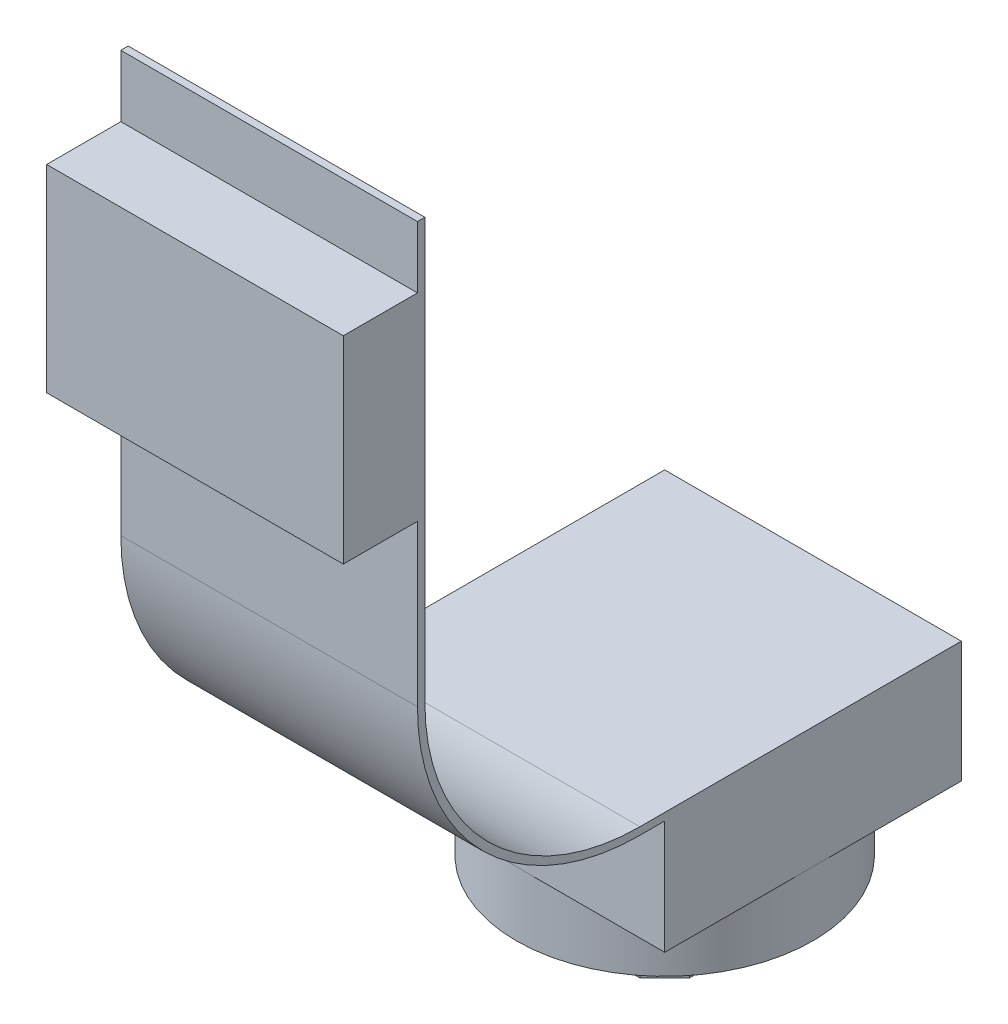
ISO-10303-21;
HEADER;
FILE_DESCRIPTION(('STEP AP214'),'2;1');
FILE_NAME('part.step','',(''),(''),'','','');
FILE_SCHEMA(('AUTOMOTIVE_DESIGN { 1 0 10303 214 1 1 1 1 }'));
ENDSEC;
DATA;
#1=APPLICATION_CONTEXT('core data for automotive mechanical design processes');
#2=APPLICATION_PROTOCOL_DEFINITION('international standard','automotive_design',2000,#1);
#3=PRODUCT_CONTEXT('',#1,'mechanical');
#4=PRODUCT('Part','Part','',(#3));
#5=PRODUCT_RELATED_PRODUCT_CATEGORY('part','',(#4));
#6=PRODUCT_DEFINITION_FORMATION('','',#4);
#7=PRODUCT_DEFINITION_CONTEXT('part definition',#1,'design');
#8=PRODUCT_DEFINITION('design','',#6,#7);
#9=PRODUCT_DEFINITION_SHAPE('','',#8);
#10=(LENGTH_UNIT() NAMED_UNIT(*) SI_UNIT(.MILLI.,.METRE.));
#11=(NAMED_UNIT(*) PLANE_ANGLE_UNIT() SI_UNIT($,.RADIAN.));
#12=(NAMED_UNIT(*) SI_UNIT($,.STERADIAN.) SOLID_ANGLE_UNIT());
#13=UNCERTAINTY_MEASURE_WITH_UNIT(LENGTH_MEASURE(1.E-05),#10,'distance_accuracy_value','');
#14=(GEOMETRIC_REPRESENTATION_CONTEXT(3) GLOBAL_UNCERTAINTY_ASSIGNED_CONTEXT((#13)) GLOBAL_UNIT_ASSIGNED_CONTEXT((#10,
#11,#12)) REPRESENTATION_CONTEXT('',''));
#15=CARTESIAN_POINT('',(0.,0.,0.));
#16=DIRECTION('',(0.,0.,1.));
#17=DIRECTION('',(1.,0.,0.));
#18=AXIS2_PLACEMENT_3D('',#15,#16,#17);
#19=CARTESIAN_POINT('',(0.,-3.6,-8.));
#20=DIRECTION('',(0.,1.,0.));
#21=DIRECTION('',(0.,0.,1.));
#22=AXIS2_PLACEMENT_3D('',#19,#20,#21);
#23=PLANE('',#22);
#24=CARTESIAN_POINT('',(0.,-3.6,-8.));
#25=DIRECTION('',(0.,-1.,0.));
#26=DIRECTION('',(0.,0.,1.));
#27=AXIS2_PLACEMENT_3D('',#24,#25,#26);
#28=CIRCLE('',#27,3.);
#29=CARTESIAN_POINT('',(0.,-3.6,-5.));
#30=VERTEX_POINT('',#29);
#31=EDGE_CURVE('E216',#30,#30,#28,.T.);
#32=ORIENTED_EDGE('',*,*,#31,.T.);
#33=EDGE_LOOP('',(#32));
#34=FACE_BOUND('',#33,.T.);
#35=DIRECTION('',(1.,0.,0.));
#36=VECTOR('',#35,1.);
#37=CARTESIAN_POINT('',(2.,-3.6,-10.));
#38=LINE('',#37,#36);
#39=CARTESIAN_POINT('',(-1.50000000000001,-3.6,-10.));
#40=VERTEX_POINT('',#39);
#41=CARTESIAN_POINT('',(1.5,-3.6,-10.));
#42=VERTEX_POINT('',#41);
#43=EDGE_CURVE('E500',#40,#42,#38,.T.);
#44=ORIENTED_EDGE('',*,*,#43,.F.);
#45=DIRECTION('',(0.707106781186544,0.,-0.707106781186551));
#46=VECTOR('',#45,1.);
#47=CARTESIAN_POINT('',(-1.75000000000001,-3.6,-9.74999999999999));
#48=LINE('',#47,#46);
#49=CARTESIAN_POINT('',(-2.,-3.6,-9.5));
#50=VERTEX_POINT('',#49);
#51=EDGE_CURVE('E245',#40,#50,#48,.F.);
#52=ORIENTED_EDGE('',*,*,#51,.T.);
#53=DIRECTION('',(0.,0.,-1.));
#54=VECTOR('',#53,1.);
#55=CARTESIAN_POINT('',(-2.,-3.6,-10.));
#56=LINE('',#55,#54);
#57=CARTESIAN_POINT('',(-2.,-3.6,-6.49999999999999));
#58=VERTEX_POINT('',#57);
#59=EDGE_CURVE('E496',#58,#50,#56,.T.);
#60=ORIENTED_EDGE('',*,*,#59,.F.);
#61=DIRECTION('',(-0.707106781186551,0.,-0.707106781186544));
#62=VECTOR('',#61,1.);
#63=CARTESIAN_POINT('',(-1.74999999999999,-3.6,-6.24999999999999));
#64=LINE('',#63,#62);
#65=CARTESIAN_POINT('',(-1.5,-3.6,-6.));
#66=VERTEX_POINT('',#65);
#67=EDGE_CURVE('E266',#58,#66,#64,.F.);
#68=ORIENTED_EDGE('',*,*,#67,.T.);
#69=DIRECTION('',(-1.,0.,0.));
#70=VECTOR('',#69,1.);
#71=CARTESIAN_POINT('',(-2.,-3.6,-6.));
#72=LINE('',#71,#70);
#73=CARTESIAN_POINT('',(1.50000000000001,-3.6,-6.));
#74=VERTEX_POINT('',#73);
#75=EDGE_CURVE('E505',#74,#66,#72,.T.);
#76=ORIENTED_EDGE('',*,*,#75,.F.);
#77=DIRECTION('',(-0.707106781186544,0.,0.707106781186551));
#78=VECTOR('',#77,1.);
#79=CARTESIAN_POINT('',(1.75000000000001,-3.6,-6.25000000000001));
#80=LINE('',#79,#78);
#81=CARTESIAN_POINT('',(2.,-3.6,-6.5));
#82=VERTEX_POINT('',#81);
#83=EDGE_CURVE('E256',#74,#82,#80,.F.);
#84=ORIENTED_EDGE('',*,*,#83,.T.);
#85=DIRECTION('',(0.,0.,1.));
#86=VECTOR('',#85,1.);
#87=CARTESIAN_POINT('',(2.,-3.6,-6.));
#88=LINE('',#87,#86);
#89=CARTESIAN_POINT('',(2.,-3.6,-9.50000000000001));
#90=VERTEX_POINT('',#89);
#91=EDGE_CURVE('E503',#90,#82,#88,.T.);
#92=ORIENTED_EDGE('',*,*,#91,.F.);
#93=DIRECTION('',(0.707106781186551,0.,0.707106781186544));
#94=VECTOR('',#93,1.);
#95=CARTESIAN_POINT('',(1.74999999999999,-3.6,-9.75000000000001));
#96=LINE('',#95,#94);
#97=EDGE_CURVE('E275',#90,#42,#96,.F.);
#98=ORIENTED_EDGE('',*,*,#97,.T.);
#99=EDGE_LOOP('',(#44,#52,#60,#68,#76,#84,#92,#98));
#100=FACE_BOUND('',#99,.T.);
#101=ADVANCED_FACE('F33',(#34,#100),#23,.F.);
#102=CARTESIAN_POINT('',(3.,-2.3,-11.));
#103=DIRECTION('',(0.,-1.,0.));
#104=DIRECTION('',(0.,0.,-1.));
#105=AXIS2_PLACEMENT_3D('',#102,#103,#104);
#106=PLANE('',#105);
#107=DIRECTION('',(-1.,0.,0.));
#108=VECTOR('',#107,1.);
#109=CARTESIAN_POINT('',(3.,-2.3,-11.));
#110=LINE('',#109,#108);
#111=CARTESIAN_POINT('',(0.,-2.29999999999109,-11.));
#112=VERTEX_POINT('',#111);
#113=CARTESIAN_POINT('',(-3.,-2.3,-11.));
#114=VERTEX_POINT('',#113);
#115=EDGE_CURVE('E213',#112,#114,#110,.T.);
#116=ORIENTED_EDGE('',*,*,#115,.F.);
#117=CARTESIAN_POINT('',(0.,-2.29999999999109,-8.));
#118=DIRECTION('',(0.,-1.,0.));
#119=DIRECTION('',(0.,0.,-1.));
#120=AXIS2_PLACEMENT_3D('',#117,#118,#119);
#121=CIRCLE('',#120,3.);
#122=CARTESIAN_POINT('',(-3.,-2.29999999999109,-8.));
#123=VERTEX_POINT('',#122);
#124=EDGE_CURVE('E197',#112,#123,#121,.F.);
#125=ORIENTED_EDGE('',*,*,#124,.T.);
#126=DIRECTION('',(0.,0.,1.));
#127=VECTOR('',#126,1.);
#128=CARTESIAN_POINT('',(-3.,-2.3,-11.));
#129=LINE('',#128,#127);
#130=EDGE_CURVE('E212',#114,#123,#129,.T.);
#131=ORIENTED_EDGE('',*,*,#130,.F.);
#132=EDGE_LOOP('',(#116,#125,#131));
#133=FACE_BOUND('',#132,.T.);
#134=ADVANCED_FACE('F210',(#133),#106,.T.);
#135=CARTESIAN_POINT('',(-3.,-2.3,-5.));
#136=VERTEX_POINT('',#135);
#137=EDGE_CURVE('E218',#123,#136,#129,.T.);
#138=ORIENTED_EDGE('',*,*,#137,.F.);
#139=CARTESIAN_POINT('',(0.,-2.29999999999109,-5.));
#140=VERTEX_POINT('',#139);
#141=EDGE_CURVE('E193',#123,#140,#121,.F.);
#142=ORIENTED_EDGE('',*,*,#141,.T.);
#143=DIRECTION('',(1.,0.,0.));
#144=VECTOR('',#143,1.);
#145=CARTESIAN_POINT('',(-3.,-2.3,-5.));
#146=LINE('',#145,#144);
#147=EDGE_CURVE('E221',#136,#140,#146,.T.);
#148=ORIENTED_EDGE('',*,*,#147,.F.);
#149=EDGE_LOOP('',(#138,#142,#148));
#150=FACE_BOUND('',#149,.T.);
#151=ADVANCED_FACE('F219',(#150),#106,.T.);
#152=CARTESIAN_POINT('',(3.,-2.3,-5.));
#153=VERTEX_POINT('',#152);
#154=EDGE_CURVE('E325',#140,#153,#146,.T.);
#155=ORIENTED_EDGE('',*,*,#154,.F.);
#156=CARTESIAN_POINT('',(3.,-2.29999999999109,-8.));
#157=VERTEX_POINT('',#156);
#158=EDGE_CURVE('E200',#140,#157,#121,.F.);
#159=ORIENTED_EDGE('',*,*,#158,.T.);
#160=DIRECTION('',(0.,0.,1.));
#161=VECTOR('',#160,1.);
#162=CARTESIAN_POINT('',(3.,-2.3,-11.));
#163=LINE('',#162,#161);
#164=EDGE_CURVE('E365',#157,#153,#163,.T.);
#165=ORIENTED_EDGE('',*,*,#164,.T.);
#166=EDGE_LOOP('',(#155,#159,#165));
#167=FACE_BOUND('',#166,.T.);
#168=ADVANCED_FACE('F402',(#167),#106,.T.);
#169=CARTESIAN_POINT('',(3.,-2.3,-11.));
#170=VERTEX_POINT('',#169);
#171=EDGE_CURVE('E366',#170,#157,#163,.T.);
#172=ORIENTED_EDGE('',*,*,#171,.T.);
#173=EDGE_CURVE('E217',#157,#112,#121,.F.);
#174=ORIENTED_EDGE('',*,*,#173,.T.);
#175=EDGE_CURVE('E236',#170,#112,#110,.T.);
#176=ORIENTED_EDGE('',*,*,#175,.F.);
#177=EDGE_LOOP('',(#172,#174,#176));
#178=FACE_BOUND('',#177,.T.);
#179=ADVANCED_FACE('F397',(#178),#106,.T.);
#180=CARTESIAN_POINT('',(3.,-2.3,1.5));
#181=DIRECTION('',(0.,0.,1.));
#182=DIRECTION('',(1.,0.,0.));
#183=AXIS2_PLACEMENT_3D('',#180,#181,#182);
#184=PLANE('',#183);
#185=DIRECTION('',(1.,0.,0.));
#186=VECTOR('',#185,1.);
#187=CARTESIAN_POINT('',(-3.,7.75,1.5));
#188=LINE('',#187,#186);
#189=CARTESIAN_POINT('',(-3.,7.75,1.5));
#190=VERTEX_POINT('',#189);
#191=CARTESIAN_POINT('',(3.,7.75,1.5));
#192=VERTEX_POINT('',#191);
#193=EDGE_CURVE('E308',#190,#192,#188,.T.);
#194=ORIENTED_EDGE('',*,*,#193,.T.);
#195=DIRECTION('',(0.,1.,0.));
#196=VECTOR('',#195,1.);
#197=CARTESIAN_POINT('',(3.,-2.3,1.5));
#198=LINE('',#197,#196);
#199=CARTESIAN_POINT('',(3.,11.75,1.5));
#200=VERTEX_POINT('',#199);
#201=EDGE_CURVE('E230',#192,#200,#198,.T.);
#202=ORIENTED_EDGE('',*,*,#201,.T.);
#203=DIRECTION('',(1.,0.,0.));
#204=VECTOR('',#203,1.);
#205=CARTESIAN_POINT('',(-3.,11.75,1.5));
#206=LINE('',#205,#204);
#207=CARTESIAN_POINT('',(-3.,11.75,1.5));
#208=VERTEX_POINT('',#207);
#209=EDGE_CURVE('E353',#208,#200,#206,.T.);
#210=ORIENTED_EDGE('',*,*,#209,.F.);
#211=DIRECTION('',(0.,1.,0.));
#212=VECTOR('',#211,1.);
#213=CARTESIAN_POINT('',(-3.,-2.3,1.5));
#214=LINE('',#213,#212);
#215=EDGE_CURVE('E356',#190,#208,#214,.T.);
#216=ORIENTED_EDGE('',*,*,#215,.F.);
#217=EDGE_LOOP('',(#194,#202,#210,#216));
#218=FACE_BOUND('',#217,.T.);
#219=ADVANCED_FACE('F454',(#218),#184,.T.);
#220=CARTESIAN_POINT('',(3.,13.,-11.));
#221=DIRECTION('',(0.,0.,-1.));
#222=DIRECTION('',(-1.,0.,0.));
#223=AXIS2_PLACEMENT_3D('',#220,#221,#222);
#224=PLANE('',#223);
#225=DIRECTION('',(1.,0.,0.));
#226=VECTOR('',#225,1.);
#227=CARTESIAN_POINT('',(-3.,0.15,-11.));
#228=LINE('',#227,#226);
#229=CARTESIAN_POINT('',(-3.,0.150000000000001,-11.));
#230=VERTEX_POINT('',#229);
#231=CARTESIAN_POINT('',(3.,0.15,-11.));
#232=VERTEX_POINT('',#231);
#233=EDGE_CURVE('E333',#230,#232,#228,.T.);
#234=ORIENTED_EDGE('',*,*,#233,.T.);
#235=DIRECTION('',(0.,-1.,0.));
#236=VECTOR('',#235,1.);
#237=CARTESIAN_POINT('',(3.,13.,-11.));
#238=LINE('',#237,#236);
#239=EDGE_CURVE('E363',#232,#170,#238,.T.);
#240=ORIENTED_EDGE('',*,*,#239,.T.);
#241=ORIENTED_EDGE('',*,*,#175,.T.);
#242=ORIENTED_EDGE('',*,*,#115,.T.);
#243=DIRECTION('',(0.,-1.,0.));
#244=VECTOR('',#243,1.);
#245=CARTESIAN_POINT('',(-3.,13.,-11.));
#246=LINE('',#245,#244);
#247=EDGE_CURVE('E225',#230,#114,#246,.T.);
#248=ORIENTED_EDGE('',*,*,#247,.F.);
#249=EDGE_LOOP('',(#234,#240,#241,#242,#248));
#250=FACE_BOUND('',#249,.T.);
#251=ADVANCED_FACE('F393',(#250),#224,.T.);
#252=CARTESIAN_POINT('',(3.,13.,1.5));
#253=DIRECTION('',(0.,1.,0.));
#254=DIRECTION('',(0.,0.,1.));
#255=AXIS2_PLACEMENT_3D('',#252,#253,#254);
#256=PLANE('',#255);
#257=DIRECTION('',(1.,0.,0.));
#258=VECTOR('',#257,1.);
#259=CARTESIAN_POINT('',(-3.,13.,-0.15));
#260=LINE('',#259,#258);
#261=CARTESIAN_POINT('',(-3.,13.,-0.15));
#262=VERTEX_POINT('',#261);
#263=CARTESIAN_POINT('',(3.,13.,-0.15));
#264=VERTEX_POINT('',#263);
#265=EDGE_CURVE('E337',#262,#264,#260,.T.);
#266=ORIENTED_EDGE('',*,*,#265,.F.);
#267=DIRECTION('',(0.,0.,-1.));
#268=VECTOR('',#267,1.);
#269=CARTESIAN_POINT('',(-3.,13.,1.5));
#270=LINE('',#269,#268);
#271=CARTESIAN_POINT('',(-3.,13.,0.));
#272=VERTEX_POINT('',#271);
#273=EDGE_CURVE('E369',#272,#262,#270,.T.);
#274=ORIENTED_EDGE('',*,*,#273,.F.);
#275=DIRECTION('',(1.,0.,0.));
#276=VECTOR('',#275,1.);
#277=CARTESIAN_POINT('',(-3.,13.,0.));
#278=LINE('',#277,#276);
#279=CARTESIAN_POINT('',(3.,13.,0.));
#280=VERTEX_POINT('',#279);
#281=EDGE_CURVE('E357',#272,#280,#278,.T.);
#282=ORIENTED_EDGE('',*,*,#281,.T.);
#283=DIRECTION('',(0.,0.,-1.));
#284=VECTOR('',#283,1.);
#285=CARTESIAN_POINT('',(3.,13.,1.5));
#286=LINE('',#285,#284);
#287=EDGE_CURVE('E231',#280,#264,#286,.T.);
#288=ORIENTED_EDGE('',*,*,#287,.T.);
#289=EDGE_LOOP('',(#266,#274,#282,#288));
#290=FACE_BOUND('',#289,.T.);
#291=ADVANCED_FACE('F376',(#290),#256,.T.);
#292=CARTESIAN_POINT('',(3.,13.,1.5));
#293=DIRECTION('',(-1.,0.,0.));
#294=DIRECTION('',(0.,0.,1.));
#295=AXIS2_PLACEMENT_3D('',#292,#293,#294);
#296=PLANE('',#295);
#297=DIRECTION('',(0.,1.,0.));
#298=VECTOR('',#297,1.);
#299=CARTESIAN_POINT('',(3.,0.,0.));
#300=LINE('',#299,#298);
#301=CARTESIAN_POINT('',(3.,4.5,0.));
#302=VERTEX_POINT('',#301);
#303=CARTESIAN_POINT('',(3.,7.75,0.));
#304=VERTEX_POINT('',#303);
#305=EDGE_CURVE('E215',#302,#304,#300,.T.);
#306=ORIENTED_EDGE('',*,*,#305,.F.);
#307=CARTESIAN_POINT('',(3.,4.5,-4.5));
#308=DIRECTION('',(-1.,0.,0.));
#309=DIRECTION('',(0.,0.,1.));
#310=AXIS2_PLACEMENT_3D('',#307,#308,#309);
#311=CIRCLE('',#310,4.5);
#312=CARTESIAN_POINT('',(3.,0.,-4.5));
#313=VERTEX_POINT('',#312);
#314=EDGE_CURVE('E55',#302,#313,#311,.F.);
#315=ORIENTED_EDGE('',*,*,#314,.T.);
#316=DIRECTION('',(0.,0.,1.));
#317=VECTOR('',#316,1.);
#318=CARTESIAN_POINT('',(3.,0.,-5.));
#319=LINE('',#318,#317);
#320=CARTESIAN_POINT('',(3.,0.,-5.));
#321=VERTEX_POINT('',#320);
#322=EDGE_CURVE('E317',#321,#313,#319,.T.);
#323=ORIENTED_EDGE('',*,*,#322,.F.);
#324=DIRECTION('',(0.,1.,0.));
#325=VECTOR('',#324,1.);
#326=CARTESIAN_POINT('',(3.,-2.3,-5.));
#327=LINE('',#326,#325);
#328=EDGE_CURVE('E311',#153,#321,#327,.T.);
#329=ORIENTED_EDGE('',*,*,#328,.F.);
#330=ORIENTED_EDGE('',*,*,#164,.F.);
#331=ORIENTED_EDGE('',*,*,#171,.F.);
#332=ORIENTED_EDGE('',*,*,#239,.F.);
#333=DIRECTION('',(0.,0.,-1.));
#334=VECTOR('',#333,1.);
#335=CARTESIAN_POINT('',(3.,0.15,-0.15));
#336=LINE('',#335,#334);
#337=CARTESIAN_POINT('',(3.,0.15,-4.5));
#338=VERTEX_POINT('',#337);
#339=EDGE_CURVE('E331',#338,#232,#336,.T.);
#340=ORIENTED_EDGE('',*,*,#339,.F.);
#341=CARTESIAN_POINT('',(3.,4.5,-4.5));
#342=DIRECTION('',(-1.,0.,0.));
#343=DIRECTION('',(0.,0.,1.));
#344=AXIS2_PLACEMENT_3D('',#341,#342,#343);
#345=CIRCLE('',#344,4.35);
#346=CARTESIAN_POINT('',(3.,4.5,-0.15));
#347=VERTEX_POINT('',#346);
#348=EDGE_CURVE('E282',#338,#347,#345,.T.);
#349=ORIENTED_EDGE('',*,*,#348,.T.);
#350=DIRECTION('',(0.,-1.,0.));
#351=VECTOR('',#350,1.);
#352=CARTESIAN_POINT('',(3.,13.,-0.15));
#353=LINE('',#352,#351);
#354=EDGE_CURVE('E324',#264,#347,#353,.T.);
#355=ORIENTED_EDGE('',*,*,#354,.F.);
#356=ORIENTED_EDGE('',*,*,#287,.F.);
#357=DIRECTION('',(0.,1.,0.));
#358=VECTOR('',#357,1.);
#359=CARTESIAN_POINT('',(3.,11.75,0.));
#360=LINE('',#359,#358);
#361=CARTESIAN_POINT('',(3.,11.75,0.));
#362=VERTEX_POINT('',#361);
#363=EDGE_CURVE('E346',#362,#280,#360,.T.);
#364=ORIENTED_EDGE('',*,*,#363,.F.);
#365=DIRECTION('',(0.,0.,-1.));
#366=VECTOR('',#365,1.);
#367=CARTESIAN_POINT('',(3.,11.75,1.5));
#368=LINE('',#367,#366);
#369=EDGE_CURVE('E339',#200,#362,#368,.T.);
#370=ORIENTED_EDGE('',*,*,#369,.F.);
#371=ORIENTED_EDGE('',*,*,#201,.F.);
#372=DIRECTION('',(0.,0.,1.));
#373=VECTOR('',#372,1.);
#374=CARTESIAN_POINT('',(3.,7.75,0.));
#375=LINE('',#374,#373);
#376=EDGE_CURVE('E301',#304,#192,#375,.T.);
#377=ORIENTED_EDGE('',*,*,#376,.F.);
#378=EDGE_LOOP('',(#306,#315,#323,#329,#330,#331,#332,#340,#349,#355,#356,#364,#370,#371,#377));
#379=FACE_BOUND('',#378,.T.);
#380=ADVANCED_FACE('F299',(#379),#296,.F.);
#381=CARTESIAN_POINT('',(-3.,13.,1.5));
#382=DIRECTION('',(-1.,0.,0.));
#383=DIRECTION('',(0.,0.,1.));
#384=AXIS2_PLACEMENT_3D('',#381,#382,#383);
#385=PLANE('',#384);
#386=DIRECTION('',(0.,0.,1.));
#387=VECTOR('',#386,1.);
#388=CARTESIAN_POINT('',(-3.,0.,-5.));
#389=LINE('',#388,#387);
#390=CARTESIAN_POINT('',(-3.,0.,-5.));
#391=VERTEX_POINT('',#390);
#392=CARTESIAN_POINT('',(-3.,0.,-4.5));
#393=VERTEX_POINT('',#392);
#394=EDGE_CURVE('E316',#391,#393,#389,.T.);
#395=ORIENTED_EDGE('',*,*,#394,.T.);
#396=CARTESIAN_POINT('',(-3.,4.5,-4.5));
#397=DIRECTION('',(-1.,0.,0.));
#398=DIRECTION('',(0.,0.,1.));
#399=AXIS2_PLACEMENT_3D('',#396,#397,#398);
#400=CIRCLE('',#399,4.5);
#401=CARTESIAN_POINT('',(-3.,4.5,0.));
#402=VERTEX_POINT('',#401);
#403=EDGE_CURVE('E11',#393,#402,#400,.T.);
#404=ORIENTED_EDGE('',*,*,#403,.T.);
#405=DIRECTION('',(0.,1.,0.));
#406=VECTOR('',#405,1.);
#407=CARTESIAN_POINT('',(-3.,0.,0.));
#408=LINE('',#407,#406);
#409=CARTESIAN_POINT('',(-3.,7.75,0.));
#410=VERTEX_POINT('',#409);
#411=EDGE_CURVE('E295',#402,#410,#408,.T.);
#412=ORIENTED_EDGE('',*,*,#411,.T.);
#413=DIRECTION('',(0.,0.,1.));
#414=VECTOR('',#413,1.);
#415=CARTESIAN_POINT('',(-3.,7.75,0.));
#416=LINE('',#415,#414);
#417=EDGE_CURVE('E305',#410,#190,#416,.T.);
#418=ORIENTED_EDGE('',*,*,#417,.T.);
#419=ORIENTED_EDGE('',*,*,#215,.T.);
#420=DIRECTION('',(0.,0.,-1.));
#421=VECTOR('',#420,1.);
#422=CARTESIAN_POINT('',(-3.,11.75,1.5));
#423=LINE('',#422,#421);
#424=CARTESIAN_POINT('',(-3.,11.75,0.));
#425=VERTEX_POINT('',#424);
#426=EDGE_CURVE('E342',#208,#425,#423,.T.);
#427=ORIENTED_EDGE('',*,*,#426,.T.);
#428=DIRECTION('',(0.,1.,0.));
#429=VECTOR('',#428,1.);
#430=CARTESIAN_POINT('',(-3.,11.75,0.));
#431=LINE('',#430,#429);
#432=EDGE_CURVE('E345',#425,#272,#431,.T.);
#433=ORIENTED_EDGE('',*,*,#432,.T.);
#434=ORIENTED_EDGE('',*,*,#273,.T.);
#435=DIRECTION('',(0.,-1.,0.));
#436=VECTOR('',#435,1.);
#437=CARTESIAN_POINT('',(-3.,13.,-0.15));
#438=LINE('',#437,#436);
#439=CARTESIAN_POINT('',(-3.,4.5,-0.15));
#440=VERTEX_POINT('',#439);
#441=EDGE_CURVE('E327',#262,#440,#438,.T.);
#442=ORIENTED_EDGE('',*,*,#441,.T.);
#443=CARTESIAN_POINT('',(-3.,4.5,-4.5));
#444=DIRECTION('',(-1.,0.,0.));
#445=DIRECTION('',(0.,0.,1.));
#446=AXIS2_PLACEMENT_3D('',#443,#444,#445);
#447=CIRCLE('',#446,4.35);
#448=CARTESIAN_POINT('',(-3.,0.15,-4.5));
#449=VERTEX_POINT('',#448);
#450=EDGE_CURVE('E284',#440,#449,#447,.F.);
#451=ORIENTED_EDGE('',*,*,#450,.T.);
#452=DIRECTION('',(0.,0.,-1.));
#453=VECTOR('',#452,1.);
#454=CARTESIAN_POINT('',(-3.,0.15,-0.15));
#455=LINE('',#454,#453);
#456=EDGE_CURVE('E330',#449,#230,#455,.T.);
#457=ORIENTED_EDGE('',*,*,#456,.T.);
#458=ORIENTED_EDGE('',*,*,#247,.T.);
#459=ORIENTED_EDGE('',*,*,#130,.T.);
#460=ORIENTED_EDGE('',*,*,#137,.T.);
#461=DIRECTION('',(0.,1.,0.));
#462=VECTOR('',#461,1.);
#463=CARTESIAN_POINT('',(-3.,-2.3,-5.));
#464=LINE('',#463,#462);
#465=EDGE_CURVE('E314',#136,#391,#464,.T.);
#466=ORIENTED_EDGE('',*,*,#465,.T.);
#467=EDGE_LOOP('',(#395,#404,#412,#418,#419,#427,#433,#434,#442,#451,#457,#458,#459,#460,#466));
#468=FACE_BOUND('',#467,.T.);
#469=ADVANCED_FACE('F228',(#468),#385,.T.);
#470=CARTESIAN_POINT('',(-3.,11.75,1.5));
#471=DIRECTION('',(0.,-1.,0.));
#472=DIRECTION('',(0.,0.,-1.));
#473=AXIS2_PLACEMENT_3D('',#470,#471,#472);
#474=PLANE('',#473);
#475=ORIENTED_EDGE('',*,*,#369,.T.);
#476=DIRECTION('',(1.,0.,0.));
#477=VECTOR('',#476,1.);
#478=CARTESIAN_POINT('',(-3.,11.75,0.));
#479=LINE('',#478,#477);
#480=EDGE_CURVE('E349',#425,#362,#479,.T.);
#481=ORIENTED_EDGE('',*,*,#480,.F.);
#482=ORIENTED_EDGE('',*,*,#426,.F.);
#483=ORIENTED_EDGE('',*,*,#209,.T.);
#484=EDGE_LOOP('',(#475,#481,#482,#483));
#485=FACE_BOUND('',#484,.T.);
#486=ADVANCED_FACE('F443',(#485),#474,.F.);
#487=CARTESIAN_POINT('',(-3.,11.75,0.));
#488=DIRECTION('',(0.,0.,-1.));
#489=DIRECTION('',(-1.,0.,0.));
#490=AXIS2_PLACEMENT_3D('',#487,#488,#489);
#491=PLANE('',#490);
#492=ORIENTED_EDGE('',*,*,#363,.T.);
#493=ORIENTED_EDGE('',*,*,#281,.F.);
#494=ORIENTED_EDGE('',*,*,#432,.F.);
#495=ORIENTED_EDGE('',*,*,#480,.T.);
#496=EDGE_LOOP('',(#492,#493,#494,#495));
#497=FACE_BOUND('',#496,.T.);
#498=ADVANCED_FACE('F440',(#497),#491,.F.);
#499=CARTESIAN_POINT('',(-3.,13.,-0.15));
#500=DIRECTION('',(0.,0.,1.));
#501=DIRECTION('',(0.,-1.,0.));
#502=AXIS2_PLACEMENT_3D('',#499,#500,#501);
#503=PLANE('',#502);
#504=ORIENTED_EDGE('',*,*,#354,.T.);
#505=DIRECTION('',(1.,0.,0.));
#506=VECTOR('',#505,1.);
#507=CARTESIAN_POINT('',(-3.,4.5,-0.15));
#508=LINE('',#507,#506);
#509=EDGE_CURVE('E280',#347,#440,#508,.F.);
#510=ORIENTED_EDGE('',*,*,#509,.T.);
#511=ORIENTED_EDGE('',*,*,#441,.F.);
#512=ORIENTED_EDGE('',*,*,#265,.T.);
#513=EDGE_LOOP('',(#504,#510,#511,#512));
#514=FACE_BOUND('',#513,.T.);
#515=ADVANCED_FACE('F380',(#514),#503,.F.);
#516=CARTESIAN_POINT('',(-3.,0.15,-0.15));
#517=DIRECTION('',(0.,-1.,0.));
#518=DIRECTION('',(0.,0.,-1.));
#519=AXIS2_PLACEMENT_3D('',#516,#517,#518);
#520=PLANE('',#519);
#521=ORIENTED_EDGE('',*,*,#456,.F.);
#522=DIRECTION('',(1.,0.,0.));
#523=VECTOR('',#522,1.);
#524=CARTESIAN_POINT('',(3.,0.15,-4.5));
#525=LINE('',#524,#523);
#526=EDGE_CURVE('E277',#449,#338,#525,.T.);
#527=ORIENTED_EDGE('',*,*,#526,.T.);
#528=ORIENTED_EDGE('',*,*,#339,.T.);
#529=ORIENTED_EDGE('',*,*,#233,.F.);
#530=EDGE_LOOP('',(#521,#527,#528,#529));
#531=FACE_BOUND('',#530,.T.);
#532=ADVANCED_FACE('F390',(#531),#520,.F.);
#533=CARTESIAN_POINT('',(-3.,-2.3,-5.));
#534=DIRECTION('',(0.,0.,-1.));
#535=DIRECTION('',(-1.,0.,0.));
#536=AXIS2_PLACEMENT_3D('',#533,#534,#535);
#537=PLANE('',#536);
#538=ORIENTED_EDGE('',*,*,#328,.T.);
#539=DIRECTION('',(1.,0.,0.));
#540=VECTOR('',#539,1.);
#541=CARTESIAN_POINT('',(-3.,0.,-5.));
#542=LINE('',#541,#540);
#543=EDGE_CURVE('E319',#391,#321,#542,.T.);
#544=ORIENTED_EDGE('',*,*,#543,.F.);
#545=ORIENTED_EDGE('',*,*,#465,.F.);
#546=ORIENTED_EDGE('',*,*,#147,.T.);
#547=ORIENTED_EDGE('',*,*,#154,.T.);
#548=EDGE_LOOP('',(#538,#544,#545,#546,#547));
#549=FACE_BOUND('',#548,.T.);
#550=ADVANCED_FACE('F404',(#549),#537,.F.);
#551=CARTESIAN_POINT('',(-3.,0.,-5.));
#552=DIRECTION('',(0.,1.,0.));
#553=DIRECTION('',(0.,0.,1.));
#554=AXIS2_PLACEMENT_3D('',#551,#552,#553);
#555=PLANE('',#554);
#556=ORIENTED_EDGE('',*,*,#322,.T.);
#557=DIRECTION('',(1.,0.,0.));
#558=VECTOR('',#557,1.);
#559=CARTESIAN_POINT('',(-3.,0.,-4.5));
#560=LINE('',#559,#558);
#561=EDGE_CURVE('E41',#313,#393,#560,.F.);
#562=ORIENTED_EDGE('',*,*,#561,.T.);
#563=ORIENTED_EDGE('',*,*,#394,.F.);
#564=ORIENTED_EDGE('',*,*,#543,.T.);
#565=EDGE_LOOP('',(#556,#562,#563,#564));
#566=FACE_BOUND('',#565,.T.);
#567=ADVANCED_FACE('F431',(#566),#555,.F.);
#568=CARTESIAN_POINT('',(-3.,0.,0.));
#569=DIRECTION('',(0.,0.,-1.));
#570=DIRECTION('',(-1.,0.,0.));
#571=AXIS2_PLACEMENT_3D('',#568,#569,#570);
#572=PLANE('',#571);
#573=ORIENTED_EDGE('',*,*,#411,.F.);
#574=DIRECTION('',(1.,0.,0.));
#575=VECTOR('',#574,1.);
#576=CARTESIAN_POINT('',(-3.,4.5,0.));
#577=LINE('',#576,#575);
#578=EDGE_CURVE('E286',#402,#302,#577,.T.);
#579=ORIENTED_EDGE('',*,*,#578,.T.);
#580=ORIENTED_EDGE('',*,*,#305,.T.);
#581=DIRECTION('',(1.,0.,0.));
#582=VECTOR('',#581,1.);
#583=CARTESIAN_POINT('',(-3.,7.75,0.));
#584=LINE('',#583,#582);
#585=EDGE_CURVE('E312',#410,#304,#584,.T.);
#586=ORIENTED_EDGE('',*,*,#585,.F.);
#587=EDGE_LOOP('',(#573,#579,#580,#586));
#588=FACE_BOUND('',#587,.T.);
#589=ADVANCED_FACE('F292',(#588),#572,.F.);
#590=CARTESIAN_POINT('',(-3.,7.75,0.));
#591=DIRECTION('',(0.,1.,0.));
#592=DIRECTION('',(0.,0.,1.));
#593=AXIS2_PLACEMENT_3D('',#590,#591,#592);
#594=PLANE('',#593);
#595=ORIENTED_EDGE('',*,*,#376,.T.);
#596=ORIENTED_EDGE('',*,*,#193,.F.);
#597=ORIENTED_EDGE('',*,*,#417,.F.);
#598=ORIENTED_EDGE('',*,*,#585,.T.);
#599=EDGE_LOOP('',(#595,#596,#597,#598));
#600=FACE_BOUND('',#599,.T.);
#601=ADVANCED_FACE('F425',(#600),#594,.F.);
#602=CARTESIAN_POINT('',(0.,500000.,-8.));
#603=DIRECTION('',(0.,-1.,0.));
#604=DIRECTION('',(0.,0.,-1.));
#605=AXIS2_PLACEMENT_3D('',#602,#603,#604);
#606=CYLINDRICAL_SURFACE('',#605,3.);
#607=ORIENTED_EDGE('',*,*,#124,.F.);
#608=ORIENTED_EDGE('',*,*,#173,.F.);
#609=ORIENTED_EDGE('',*,*,#158,.F.);
#610=ORIENTED_EDGE('',*,*,#141,.F.);
#611=EDGE_LOOP('',(#607,#608,#609,#610));
#612=FACE_BOUND('',#611,.T.);
#613=ORIENTED_EDGE('',*,*,#31,.F.);
#614=EDGE_LOOP('',(#613));
#615=FACE_BOUND('',#614,.T.);
#616=ADVANCED_FACE('F195',(#612,#615),#606,.T.);
#617=CARTESIAN_POINT('',(2.,-4.,-10.));
#618=DIRECTION('',(0.,0.,1.));
#619=DIRECTION('',(1.,0.,0.));
#620=AXIS2_PLACEMENT_3D('',#617,#618,#619);
#621=PLANE('',#620);
#622=ORIENTED_EDGE('',*,*,#43,.T.);
#623=DIRECTION('',(0.,-1.,0.));
#624=VECTOR('',#623,1.);
#625=CARTESIAN_POINT('',(1.5,-4.,-10.));
#626=LINE('',#625,#624);
#627=CARTESIAN_POINT('',(1.5,-4.,-10.));
#628=VERTEX_POINT('',#627);
#629=EDGE_CURVE('E271',#42,#628,#626,.T.);
#630=ORIENTED_EDGE('',*,*,#629,.T.);
#631=DIRECTION('',(1.,0.,0.));
#632=VECTOR('',#631,1.);
#633=CARTESIAN_POINT('',(2.,-4.,-10.));
#634=LINE('',#633,#632);
#635=CARTESIAN_POINT('',(-1.50000000000001,-4.,-10.));
#636=VERTEX_POINT('',#635);
#637=EDGE_CURVE('E485',#636,#628,#634,.T.);
#638=ORIENTED_EDGE('',*,*,#637,.F.);
#639=DIRECTION('',(0.,1.,0.));
#640=VECTOR('',#639,1.);
#641=CARTESIAN_POINT('',(-1.50000000000001,-4.,-10.));
#642=LINE('',#641,#640);
#643=EDGE_CURVE('E205',#636,#40,#642,.T.);
#644=ORIENTED_EDGE('',*,*,#643,.T.);
#645=EDGE_LOOP('',(#622,#630,#638,#644));
#646=FACE_BOUND('',#645,.T.);
#647=ADVANCED_FACE('F421',(#646),#621,.F.);
#648=CARTESIAN_POINT('',(2.,-4.,-6.));
#649=DIRECTION('',(-1.,0.,0.));
#650=DIRECTION('',(0.,0.,1.));
#651=AXIS2_PLACEMENT_3D('',#648,#649,#650);
#652=PLANE('',#651);
#653=DIRECTION('',(0.,0.,1.));
#654=VECTOR('',#653,1.);
#655=CARTESIAN_POINT('',(2.,-4.,-6.));
#656=LINE('',#655,#654);
#657=CARTESIAN_POINT('',(2.,-4.,-9.50000000000001));
#658=VERTEX_POINT('',#657);
#659=CARTESIAN_POINT('',(2.,-4.,-6.5));
#660=VERTEX_POINT('',#659);
#661=EDGE_CURVE('E483',#658,#660,#656,.T.);
#662=ORIENTED_EDGE('',*,*,#661,.F.);
#663=DIRECTION('',(0.,1.,0.));
#664=VECTOR('',#663,1.);
#665=CARTESIAN_POINT('',(2.,-4.,-9.50000000000001));
#666=LINE('',#665,#664);
#667=EDGE_CURVE('E268',#658,#90,#666,.T.);
#668=ORIENTED_EDGE('',*,*,#667,.T.);
#669=ORIENTED_EDGE('',*,*,#91,.T.);
#670=DIRECTION('',(0.,-1.,0.));
#671=VECTOR('',#670,1.);
#672=CARTESIAN_POINT('',(2.,-4.,-6.5));
#673=LINE('',#672,#671);
#674=EDGE_CURVE('E251',#82,#660,#673,.T.);
#675=ORIENTED_EDGE('',*,*,#674,.T.);
#676=EDGE_LOOP('',(#662,#668,#669,#675));
#677=FACE_BOUND('',#676,.T.);
#678=ADVANCED_FACE('F487',(#677),#652,.F.);
#679=CARTESIAN_POINT('',(-2.,-4.,-6.));
#680=DIRECTION('',(0.,0.,-1.));
#681=DIRECTION('',(-1.,0.,0.));
#682=AXIS2_PLACEMENT_3D('',#679,#680,#681);
#683=PLANE('',#682);
#684=ORIENTED_EDGE('',*,*,#75,.T.);
#685=DIRECTION('',(0.,-1.,0.));
#686=VECTOR('',#685,1.);
#687=CARTESIAN_POINT('',(-1.5,-4.,-6.));
#688=LINE('',#687,#686);
#689=CARTESIAN_POINT('',(-1.5,-4.,-6.));
#690=VERTEX_POINT('',#689);
#691=EDGE_CURVE('E262',#66,#690,#688,.T.);
#692=ORIENTED_EDGE('',*,*,#691,.T.);
#693=DIRECTION('',(-1.,0.,0.));
#694=VECTOR('',#693,1.);
#695=CARTESIAN_POINT('',(-2.,-4.,-6.));
#696=LINE('',#695,#694);
#697=CARTESIAN_POINT('',(1.50000000000001,-4.,-6.));
#698=VERTEX_POINT('',#697);
#699=EDGE_CURVE('E491',#698,#690,#696,.T.);
#700=ORIENTED_EDGE('',*,*,#699,.F.);
#701=DIRECTION('',(0.,1.,0.));
#702=VECTOR('',#701,1.);
#703=CARTESIAN_POINT('',(1.50000000000001,-4.,-6.));
#704=LINE('',#703,#702);
#705=EDGE_CURVE('E248',#698,#74,#704,.T.);
#706=ORIENTED_EDGE('',*,*,#705,.T.);
#707=EDGE_LOOP('',(#684,#692,#700,#706));
#708=FACE_BOUND('',#707,.T.);
#709=ADVANCED_FACE('F530',(#708),#683,.F.);
#710=CARTESIAN_POINT('',(-2.,-4.,-10.));
#711=DIRECTION('',(1.,0.,0.));
#712=DIRECTION('',(0.,0.,-1.));
#713=AXIS2_PLACEMENT_3D('',#710,#711,#712);
#714=PLANE('',#713);
#715=DIRECTION('',(0.,0.,-1.));
#716=VECTOR('',#715,1.);
#717=CARTESIAN_POINT('',(-2.,-4.,-10.));
#718=LINE('',#717,#716);
#719=CARTESIAN_POINT('',(-2.,-4.,-6.49999999999999));
#720=VERTEX_POINT('',#719);
#721=CARTESIAN_POINT('',(-2.,-4.,-9.5));
#722=VERTEX_POINT('',#721);
#723=EDGE_CURVE('E494',#720,#722,#718,.T.);
#724=ORIENTED_EDGE('',*,*,#723,.F.);
#725=DIRECTION('',(0.,1.,0.));
#726=VECTOR('',#725,1.);
#727=CARTESIAN_POINT('',(-2.,-4.,-6.49999999999999));
#728=LINE('',#727,#726);
#729=EDGE_CURVE('E259',#720,#58,#728,.T.);
#730=ORIENTED_EDGE('',*,*,#729,.T.);
#731=ORIENTED_EDGE('',*,*,#59,.T.);
#732=DIRECTION('',(0.,-1.,0.));
#733=VECTOR('',#732,1.);
#734=CARTESIAN_POINT('',(-2.,-4.,-9.5));
#735=LINE('',#734,#733);
#736=EDGE_CURVE('E240',#50,#722,#735,.T.);
#737=ORIENTED_EDGE('',*,*,#736,.T.);
#738=EDGE_LOOP('',(#724,#730,#731,#737));
#739=FACE_BOUND('',#738,.T.);
#740=ADVANCED_FACE('F519',(#739),#714,.F.);
#741=CARTESIAN_POINT('',(-2.,-4.,-10.));
#742=DIRECTION('',(0.,1.,0.));
#743=DIRECTION('',(0.,0.,1.));
#744=AXIS2_PLACEMENT_3D('',#741,#742,#743);
#745=PLANE('',#744);
#746=ORIENTED_EDGE('',*,*,#637,.T.);
#747=DIRECTION('',(-0.707106781186551,0.,-0.707106781186544));
#748=VECTOR('',#747,1.);
#749=CARTESIAN_POINT('',(2.,-4.,-9.50000000000001));
#750=LINE('',#749,#748);
#751=EDGE_CURVE('E273',#628,#658,#750,.F.);
#752=ORIENTED_EDGE('',*,*,#751,.T.);
#753=ORIENTED_EDGE('',*,*,#661,.T.);
#754=DIRECTION('',(0.707106781186544,0.,-0.707106781186551));
#755=VECTOR('',#754,1.);
#756=CARTESIAN_POINT('',(1.50000000000001,-4.,-6.));
#757=LINE('',#756,#755);
#758=EDGE_CURVE('E254',#660,#698,#757,.F.);
#759=ORIENTED_EDGE('',*,*,#758,.T.);
#760=ORIENTED_EDGE('',*,*,#699,.T.);
#761=DIRECTION('',(0.707106781186551,0.,0.707106781186544));
#762=VECTOR('',#761,1.);
#763=CARTESIAN_POINT('',(-2.,-4.,-6.49999999999999));
#764=LINE('',#763,#762);
#765=EDGE_CURVE('E264',#690,#720,#764,.F.);
#766=ORIENTED_EDGE('',*,*,#765,.T.);
#767=ORIENTED_EDGE('',*,*,#723,.T.);
#768=DIRECTION('',(-0.707106781186544,0.,0.707106781186551));
#769=VECTOR('',#768,1.);
#770=CARTESIAN_POINT('',(-1.50000000000001,-4.,-10.));
#771=LINE('',#770,#769);
#772=EDGE_CURVE('E243',#722,#636,#771,.F.);
#773=ORIENTED_EDGE('',*,*,#772,.T.);
#774=EDGE_LOOP('',(#746,#752,#753,#759,#760,#766,#767,#773));
#775=FACE_BOUND('',#774,.T.);
#776=ADVANCED_FACE('F464',(#775),#745,.F.);
#777=CARTESIAN_POINT('',(-1.50000000000001,-4.,-10.));
#778=DIRECTION('',(0.707106781186551,0.,0.707106781186544));
#779=DIRECTION('',(0.707106781186544,0.,-0.707106781186551));
#780=AXIS2_PLACEMENT_3D('',#777,#778,#779);
#781=PLANE('',#780);
#782=ORIENTED_EDGE('',*,*,#772,.F.);
#783=ORIENTED_EDGE('',*,*,#736,.F.);
#784=ORIENTED_EDGE('',*,*,#51,.F.);
#785=ORIENTED_EDGE('',*,*,#643,.F.);
#786=EDGE_LOOP('',(#782,#783,#784,#785));
#787=FACE_BOUND('',#786,.T.);
#788=ADVANCED_FACE('F460',(#787),#781,.F.);
#789=CARTESIAN_POINT('',(1.50000000000001,-4.,-6.));
#790=DIRECTION('',(-0.707106781186551,0.,-0.707106781186544));
#791=DIRECTION('',(-0.707106781186544,0.,0.707106781186551));
#792=AXIS2_PLACEMENT_3D('',#789,#790,#791);
#793=PLANE('',#792);
#794=ORIENTED_EDGE('',*,*,#758,.F.);
#795=ORIENTED_EDGE('',*,*,#674,.F.);
#796=ORIENTED_EDGE('',*,*,#83,.F.);
#797=ORIENTED_EDGE('',*,*,#705,.F.);
#798=EDGE_LOOP('',(#794,#795,#796,#797));
#799=FACE_BOUND('',#798,.T.);
#800=ADVANCED_FACE('F463',(#799),#793,.F.);
#801=CARTESIAN_POINT('',(-2.,-4.,-6.49999999999999));
#802=DIRECTION('',(0.707106781186544,0.,-0.707106781186551));
#803=DIRECTION('',(-0.707106781186551,0.,-0.707106781186544));
#804=AXIS2_PLACEMENT_3D('',#801,#802,#803);
#805=PLANE('',#804);
#806=ORIENTED_EDGE('',*,*,#765,.F.);
#807=ORIENTED_EDGE('',*,*,#691,.F.);
#808=ORIENTED_EDGE('',*,*,#67,.F.);
#809=ORIENTED_EDGE('',*,*,#729,.F.);
#810=EDGE_LOOP('',(#806,#807,#808,#809));
#811=FACE_BOUND('',#810,.T.);
#812=ADVANCED_FACE('F468',(#811),#805,.F.);
#813=CARTESIAN_POINT('',(2.,-4.,-9.50000000000001));
#814=DIRECTION('',(-0.707106781186544,0.,0.707106781186551));
#815=DIRECTION('',(0.707106781186551,0.,0.707106781186544));
#816=AXIS2_PLACEMENT_3D('',#813,#814,#815);
#817=PLANE('',#816);
#818=ORIENTED_EDGE('',*,*,#751,.F.);
#819=ORIENTED_EDGE('',*,*,#629,.F.);
#820=ORIENTED_EDGE('',*,*,#97,.F.);
#821=ORIENTED_EDGE('',*,*,#667,.F.);
#822=EDGE_LOOP('',(#818,#819,#820,#821));
#823=FACE_BOUND('',#822,.T.);
#824=ADVANCED_FACE('F409',(#823),#817,.F.);
#825=CARTESIAN_POINT('',(-3.,4.5,-4.5));
#826=DIRECTION('',(-1.,0.,0.));
#827=DIRECTION('',(0.,0.,1.));
#828=AXIS2_PLACEMENT_3D('',#825,#826,#827);
#829=CYLINDRICAL_SURFACE('',#828,4.35);
#830=ORIENTED_EDGE('',*,*,#450,.F.);
#831=ORIENTED_EDGE('',*,*,#509,.F.);
#832=ORIENTED_EDGE('',*,*,#348,.F.);
#833=ORIENTED_EDGE('',*,*,#526,.F.);
#834=EDGE_LOOP('',(#830,#831,#832,#833));
#835=FACE_BOUND('',#834,.T.);
#836=ADVANCED_FACE('F387',(#835),#829,.F.);
#837=CARTESIAN_POINT('',(-3.,4.5,-4.5));
#838=DIRECTION('',(1.,0.,0.));
#839=DIRECTION('',(0.,0.,-1.));
#840=AXIS2_PLACEMENT_3D('',#837,#838,#839);
#841=CYLINDRICAL_SURFACE('',#840,4.5);
#842=ORIENTED_EDGE('',*,*,#403,.F.);
#843=ORIENTED_EDGE('',*,*,#561,.F.);
#844=ORIENTED_EDGE('',*,*,#314,.F.);
#845=ORIENTED_EDGE('',*,*,#578,.F.);
#846=EDGE_LOOP('',(#842,#843,#844,#845));
#847=FACE_BOUND('',#846,.T.);
#848=ADVANCED_FACE('F35',(#847),#841,.T.);
#849=CLOSED_SHELL('',(#101,#134,#151,#168,#179,#219,#251,#291,#380,#469,#486,#498,#515,#532,
#550,#567,#589,#601,#616,#647,#678,#709,#740,#776,#788,#800,#812,#824,#836,#848));
#850=MANIFOLD_SOLID_BREP('B2',#849);
#851=ADVANCED_BREP_SHAPE_REPRESENTATION('',(#18,#850),#14);
#852=SHAPE_DEFINITION_REPRESENTATION(#9,#851);
ENDSEC;
END-ISO-10303-21;
